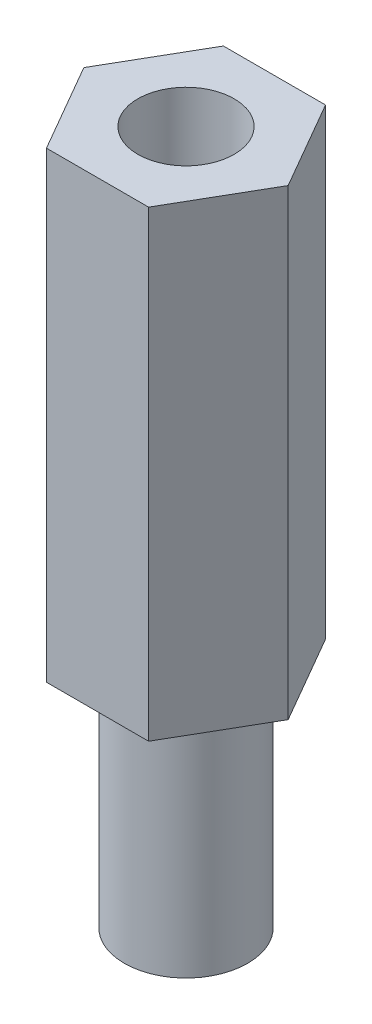
ISO-10303-21;
HEADER;
FILE_DESCRIPTION(('STEP AP214'),'2;1');
FILE_NAME('part.step','',(''),(''),'','','');
FILE_SCHEMA(('AUTOMOTIVE_DESIGN { 1 0 10303 214 1 1 1 1 }'));
ENDSEC;
DATA;
#1=APPLICATION_CONTEXT('core data for automotive mechanical design processes');
#2=APPLICATION_PROTOCOL_DEFINITION('international standard','automotive_design',2000,#1);
#3=PRODUCT_CONTEXT('',#1,'mechanical');
#4=PRODUCT('Part','Part','',(#3));
#5=PRODUCT_RELATED_PRODUCT_CATEGORY('part','',(#4));
#6=PRODUCT_DEFINITION_FORMATION('','',#4);
#7=PRODUCT_DEFINITION_CONTEXT('part definition',#1,'design');
#8=PRODUCT_DEFINITION('design','',#6,#7);
#9=PRODUCT_DEFINITION_SHAPE('','',#8);
#10=(LENGTH_UNIT() NAMED_UNIT(*) SI_UNIT(.MILLI.,.METRE.));
#11=(NAMED_UNIT(*) PLANE_ANGLE_UNIT() SI_UNIT($,.RADIAN.));
#12=(NAMED_UNIT(*) SI_UNIT($,.STERADIAN.) SOLID_ANGLE_UNIT());
#13=UNCERTAINTY_MEASURE_WITH_UNIT(LENGTH_MEASURE(1.E-05),#10,'distance_accuracy_value','');
#14=(GEOMETRIC_REPRESENTATION_CONTEXT(3) GLOBAL_UNCERTAINTY_ASSIGNED_CONTEXT((#13)) GLOBAL_UNIT_ASSIGNED_CONTEXT((#10,
#11,#12)) REPRESENTATION_CONTEXT('',''));
#15=CARTESIAN_POINT('',(0.,0.,0.));
#16=DIRECTION('',(0.,0.,1.));
#17=DIRECTION('',(1.,0.,0.));
#18=AXIS2_PLACEMENT_3D('',#15,#16,#17);
#19=CARTESIAN_POINT('',(-1.325,12.,2.29496732002876));
#20=DIRECTION('',(0.,0.,-1.));
#21=DIRECTION('',(-1.,0.,0.));
#22=AXIS2_PLACEMENT_3D('',#19,#20,#21);
#23=PLANE('',#22);
#24=DIRECTION('',(1.,0.,0.));
#25=VECTOR('',#24,1.);
#26=CARTESIAN_POINT('',(-1.325,0.,2.29496732002876));
#27=LINE('',#26,#25);
#28=CARTESIAN_POINT('',(-1.325,0.,2.29496732002876));
#29=VERTEX_POINT('',#28);
#30=CARTESIAN_POINT('',(1.325,0.,2.29496732002876));
#31=VERTEX_POINT('',#30);
#32=EDGE_CURVE('E122',#29,#31,#27,.T.);
#33=ORIENTED_EDGE('',*,*,#32,.T.);
#34=DIRECTION('',(0.,-1.,0.));
#35=VECTOR('',#34,1.);
#36=CARTESIAN_POINT('',(1.325,12.,2.29496732002876));
#37=LINE('',#36,#35);
#38=CARTESIAN_POINT('',(1.325,12.,2.29496732002876));
#39=VERTEX_POINT('',#38);
#40=EDGE_CURVE('E45',#39,#31,#37,.T.);
#41=ORIENTED_EDGE('',*,*,#40,.F.);
#42=DIRECTION('',(1.,0.,0.));
#43=VECTOR('',#42,1.);
#44=CARTESIAN_POINT('',(-1.325,12.,2.29496732002876));
#45=LINE('',#44,#43);
#46=CARTESIAN_POINT('',(-1.325,12.,2.29496732002876));
#47=VERTEX_POINT('',#46);
#48=EDGE_CURVE('E133',#47,#39,#45,.T.);
#49=ORIENTED_EDGE('',*,*,#48,.F.);
#50=DIRECTION('',(0.,-1.,0.));
#51=VECTOR('',#50,1.);
#52=CARTESIAN_POINT('',(-1.325,12.,2.29496732002876));
#53=LINE('',#52,#51);
#54=EDGE_CURVE('E118',#47,#29,#53,.T.);
#55=ORIENTED_EDGE('',*,*,#54,.T.);
#56=EDGE_LOOP('',(#33,#41,#49,#55));
#57=FACE_BOUND('',#56,.T.);
#58=ADVANCED_FACE('F37',(#57),#23,.F.);
#59=CARTESIAN_POINT('',(1.325,12.,2.29496732002876));
#60=DIRECTION('',(-0.866025403784439,0.,-0.5));
#61=DIRECTION('',(-0.5,0.,0.866025403784439));
#62=AXIS2_PLACEMENT_3D('',#59,#60,#61);
#63=PLANE('',#62);
#64=DIRECTION('',(0.5,0.,-0.866025403784439));
#65=VECTOR('',#64,1.);
#66=CARTESIAN_POINT('',(1.325,0.,2.29496732002876));
#67=LINE('',#66,#65);
#68=CARTESIAN_POINT('',(2.65,0.,0.));
#69=VERTEX_POINT('',#68);
#70=EDGE_CURVE('E125',#31,#69,#67,.T.);
#71=ORIENTED_EDGE('',*,*,#70,.T.);
#72=DIRECTION('',(0.,-1.,0.));
#73=VECTOR('',#72,1.);
#74=CARTESIAN_POINT('',(2.65,12.,0.));
#75=LINE('',#74,#73);
#76=CARTESIAN_POINT('',(2.65,12.,0.));
#77=VERTEX_POINT('',#76);
#78=EDGE_CURVE('E137',#77,#69,#75,.T.);
#79=ORIENTED_EDGE('',*,*,#78,.F.);
#80=DIRECTION('',(0.5,0.,-0.866025403784439));
#81=VECTOR('',#80,1.);
#82=CARTESIAN_POINT('',(1.325,12.,2.29496732002876));
#83=LINE('',#82,#81);
#84=EDGE_CURVE('E91',#39,#77,#83,.T.);
#85=ORIENTED_EDGE('',*,*,#84,.F.);
#86=ORIENTED_EDGE('',*,*,#40,.T.);
#87=EDGE_LOOP('',(#71,#79,#85,#86));
#88=FACE_BOUND('',#87,.T.);
#89=ADVANCED_FACE('F140',(#88),#63,.F.);
#90=CARTESIAN_POINT('',(2.65,12.,0.));
#91=DIRECTION('',(-0.866025403784438,0.,0.5));
#92=DIRECTION('',(0.5,0.,0.866025403784439));
#93=AXIS2_PLACEMENT_3D('',#90,#91,#92);
#94=PLANE('',#93);
#95=DIRECTION('',(-0.5,0.,-0.866025403784439));
#96=VECTOR('',#95,1.);
#97=CARTESIAN_POINT('',(2.65,0.,0.));
#98=LINE('',#97,#96);
#99=CARTESIAN_POINT('',(1.325,0.,-2.29496732002876));
#100=VERTEX_POINT('',#99);
#101=EDGE_CURVE('E128',#69,#100,#98,.T.);
#102=ORIENTED_EDGE('',*,*,#101,.T.);
#103=DIRECTION('',(0.,-1.,0.));
#104=VECTOR('',#103,1.);
#105=CARTESIAN_POINT('',(1.325,12.,-2.29496732002876));
#106=LINE('',#105,#104);
#107=CARTESIAN_POINT('',(1.325,12.,-2.29496732002876));
#108=VERTEX_POINT('',#107);
#109=EDGE_CURVE('E113',#108,#100,#106,.T.);
#110=ORIENTED_EDGE('',*,*,#109,.F.);
#111=DIRECTION('',(-0.5,0.,-0.866025403784439));
#112=VECTOR('',#111,1.);
#113=CARTESIAN_POINT('',(2.65,12.,0.));
#114=LINE('',#113,#112);
#115=EDGE_CURVE('E104',#77,#108,#114,.T.);
#116=ORIENTED_EDGE('',*,*,#115,.F.);
#117=ORIENTED_EDGE('',*,*,#78,.T.);
#118=EDGE_LOOP('',(#102,#110,#116,#117));
#119=FACE_BOUND('',#118,.T.);
#120=ADVANCED_FACE('F148',(#119),#94,.F.);
#121=CARTESIAN_POINT('',(1.325,12.,-2.29496732002876));
#122=DIRECTION('',(0.,0.,1.));
#123=DIRECTION('',(1.,0.,0.));
#124=AXIS2_PLACEMENT_3D('',#121,#122,#123);
#125=PLANE('',#124);
#126=DIRECTION('',(-1.,0.,0.));
#127=VECTOR('',#126,1.);
#128=CARTESIAN_POINT('',(1.325,0.,-2.29496732002876));
#129=LINE('',#128,#127);
#130=CARTESIAN_POINT('',(-1.325,0.,-2.29496732002876));
#131=VERTEX_POINT('',#130);
#132=EDGE_CURVE('E112',#100,#131,#129,.T.);
#133=ORIENTED_EDGE('',*,*,#132,.T.);
#134=DIRECTION('',(0.,-1.,0.));
#135=VECTOR('',#134,1.);
#136=CARTESIAN_POINT('',(-1.325,12.,-2.29496732002876));
#137=LINE('',#136,#135);
#138=CARTESIAN_POINT('',(-1.325,12.,-2.29496732002876));
#139=VERTEX_POINT('',#138);
#140=EDGE_CURVE('E109',#139,#131,#137,.T.);
#141=ORIENTED_EDGE('',*,*,#140,.F.);
#142=DIRECTION('',(-1.,0.,0.));
#143=VECTOR('',#142,1.);
#144=CARTESIAN_POINT('',(1.325,12.,-2.29496732002876));
#145=LINE('',#144,#143);
#146=EDGE_CURVE('E98',#108,#139,#145,.T.);
#147=ORIENTED_EDGE('',*,*,#146,.F.);
#148=ORIENTED_EDGE('',*,*,#109,.T.);
#149=EDGE_LOOP('',(#133,#141,#147,#148));
#150=FACE_BOUND('',#149,.T.);
#151=ADVANCED_FACE('F110',(#150),#125,.F.);
#152=CARTESIAN_POINT('',(-1.325,12.,-2.29496732002876));
#153=DIRECTION('',(0.866025403784439,0.,0.5));
#154=DIRECTION('',(0.5,0.,-0.866025403784439));
#155=AXIS2_PLACEMENT_3D('',#152,#153,#154);
#156=PLANE('',#155);
#157=DIRECTION('',(-0.5,0.,0.866025403784439));
#158=VECTOR('',#157,1.);
#159=CARTESIAN_POINT('',(-1.325,0.,-2.29496732002876));
#160=LINE('',#159,#158);
#161=CARTESIAN_POINT('',(-2.65,0.,0.));
#162=VERTEX_POINT('',#161);
#163=EDGE_CURVE('E76',#131,#162,#160,.T.);
#164=ORIENTED_EDGE('',*,*,#163,.T.);
#165=DIRECTION('',(0.,-1.,0.));
#166=VECTOR('',#165,1.);
#167=CARTESIAN_POINT('',(-2.65,12.,0.));
#168=LINE('',#167,#166);
#169=CARTESIAN_POINT('',(-2.65,12.,0.));
#170=VERTEX_POINT('',#169);
#171=EDGE_CURVE('E114',#170,#162,#168,.T.);
#172=ORIENTED_EDGE('',*,*,#171,.F.);
#173=DIRECTION('',(-0.5,0.,0.866025403784439));
#174=VECTOR('',#173,1.);
#175=CARTESIAN_POINT('',(-1.325,12.,-2.29496732002876));
#176=LINE('',#175,#174);
#177=EDGE_CURVE('E102',#139,#170,#176,.T.);
#178=ORIENTED_EDGE('',*,*,#177,.F.);
#179=ORIENTED_EDGE('',*,*,#140,.T.);
#180=EDGE_LOOP('',(#164,#172,#178,#179));
#181=FACE_BOUND('',#180,.T.);
#182=ADVANCED_FACE('F116',(#181),#156,.F.);
#183=CARTESIAN_POINT('',(-2.65,12.,0.));
#184=DIRECTION('',(0.866025403784438,0.,-0.5));
#185=DIRECTION('',(-0.5,0.,-0.866025403784439));
#186=AXIS2_PLACEMENT_3D('',#183,#184,#185);
#187=PLANE('',#186);
#188=DIRECTION('',(0.5,0.,0.866025403784439));
#189=VECTOR('',#188,1.);
#190=CARTESIAN_POINT('',(-2.65,0.,0.));
#191=LINE('',#190,#189);
#192=EDGE_CURVE('E82',#162,#29,#191,.T.);
#193=ORIENTED_EDGE('',*,*,#192,.T.);
#194=ORIENTED_EDGE('',*,*,#54,.F.);
#195=DIRECTION('',(0.5,0.,0.866025403784439));
#196=VECTOR('',#195,1.);
#197=CARTESIAN_POINT('',(-2.65,12.,0.));
#198=LINE('',#197,#196);
#199=EDGE_CURVE('E53',#170,#47,#198,.T.);
#200=ORIENTED_EDGE('',*,*,#199,.F.);
#201=ORIENTED_EDGE('',*,*,#171,.T.);
#202=EDGE_LOOP('',(#193,#194,#200,#201));
#203=FACE_BOUND('',#202,.T.);
#204=ADVANCED_FACE('F171',(#203),#187,.F.);
#205=CARTESIAN_POINT('',(0.,12.,0.));
#206=DIRECTION('',(0.,1.,0.));
#207=DIRECTION('',(0.,0.,1.));
#208=AXIS2_PLACEMENT_3D('',#205,#206,#207);
#209=PLANE('',#208);
#210=CARTESIAN_POINT('',(0.,12.,0.));
#211=DIRECTION('',(0.,1.,0.));
#212=DIRECTION('',(0.,0.,1.));
#213=AXIS2_PLACEMENT_3D('',#210,#211,#212);
#214=CIRCLE('',#213,1.25);
#215=CARTESIAN_POINT('',(0.,12.,1.25));
#216=VERTEX_POINT('',#215);
#217=EDGE_CURVE('E155',#216,#216,#214,.T.);
#218=ORIENTED_EDGE('',*,*,#217,.F.);
#219=EDGE_LOOP('',(#218));
#220=FACE_BOUND('',#219,.T.);
#221=ORIENTED_EDGE('',*,*,#48,.T.);
#222=ORIENTED_EDGE('',*,*,#84,.T.);
#223=ORIENTED_EDGE('',*,*,#115,.T.);
#224=ORIENTED_EDGE('',*,*,#146,.T.);
#225=ORIENTED_EDGE('',*,*,#177,.T.);
#226=ORIENTED_EDGE('',*,*,#199,.T.);
#227=EDGE_LOOP('',(#221,#222,#223,#224,#225,#226));
#228=FACE_BOUND('',#227,.T.);
#229=ADVANCED_FACE('F100',(#220,#228),#209,.T.);
#230=CARTESIAN_POINT('',(0.,0.,0.));
#231=DIRECTION('',(0.,1.,0.));
#232=DIRECTION('',(0.,0.,1.));
#233=AXIS2_PLACEMENT_3D('',#230,#231,#232);
#234=PLANE('',#233);
#235=CARTESIAN_POINT('',(0.,0.,0.));
#236=DIRECTION('',(0.,1.,0.));
#237=DIRECTION('',(0.,0.,1.));
#238=AXIS2_PLACEMENT_3D('',#235,#236,#237);
#239=CIRCLE('',#238,1.6);
#240=CARTESIAN_POINT('',(0.,0.,1.6));
#241=VERTEX_POINT('',#240);
#242=EDGE_CURVE('E11',#241,#241,#239,.F.);
#243=ORIENTED_EDGE('',*,*,#242,.F.);
#244=EDGE_LOOP('',(#243));
#245=FACE_BOUND('',#244,.T.);
#246=ORIENTED_EDGE('',*,*,#32,.F.);
#247=ORIENTED_EDGE('',*,*,#192,.F.);
#248=ORIENTED_EDGE('',*,*,#163,.F.);
#249=ORIENTED_EDGE('',*,*,#132,.F.);
#250=ORIENTED_EDGE('',*,*,#101,.F.);
#251=ORIENTED_EDGE('',*,*,#70,.F.);
#252=EDGE_LOOP('',(#246,#247,#248,#249,#250,#251));
#253=FACE_BOUND('',#252,.T.);
#254=ADVANCED_FACE('F145',(#245,#253),#234,.F.);
#255=CARTESIAN_POINT('',(0.,-6.,0.));
#256=DIRECTION('',(0.,1.,0.));
#257=DIRECTION('',(0.,0.,1.));
#258=AXIS2_PLACEMENT_3D('',#255,#256,#257);
#259=CYLINDRICAL_SURFACE('',#258,1.6);
#260=CARTESIAN_POINT('',(0.,-6.,0.));
#261=DIRECTION('',(0.,-1.,0.));
#262=DIRECTION('',(0.,0.,-1.));
#263=AXIS2_PLACEMENT_3D('',#260,#261,#262);
#264=CIRCLE('',#263,1.6);
#265=CARTESIAN_POINT('',(0.,-6.,-1.6));
#266=VERTEX_POINT('',#265);
#267=EDGE_CURVE('E126',#266,#266,#264,.T.);
#268=ORIENTED_EDGE('',*,*,#267,.F.);
#269=EDGE_LOOP('',(#268));
#270=FACE_BOUND('',#269,.T.);
#271=ORIENTED_EDGE('',*,*,#242,.T.);
#272=EDGE_LOOP('',(#271));
#273=FACE_BOUND('',#272,.T.);
#274=ADVANCED_FACE('F177',(#270,#273),#259,.T.);
#275=CARTESIAN_POINT('',(0.,-6.,0.));
#276=DIRECTION('',(0.,-1.,0.));
#277=DIRECTION('',(0.,0.,-1.));
#278=AXIS2_PLACEMENT_3D('',#275,#276,#277);
#279=PLANE('',#278);
#280=ORIENTED_EDGE('',*,*,#267,.T.);
#281=EDGE_LOOP('',(#280));
#282=FACE_BOUND('',#281,.T.);
#283=ADVANCED_FACE('F166',(#282),#279,.T.);
#284=CARTESIAN_POINT('',(0.,7.,0.));
#285=DIRECTION('',(0.,1.,0.));
#286=DIRECTION('',(0.,0.,1.));
#287=AXIS2_PLACEMENT_3D('',#284,#285,#286);
#288=CYLINDRICAL_SURFACE('',#287,1.25);
#289=CARTESIAN_POINT('',(0.,7.,0.));
#290=DIRECTION('',(0.,1.,0.));
#291=DIRECTION('',(0.,0.,1.));
#292=AXIS2_PLACEMENT_3D('',#289,#290,#291);
#293=CIRCLE('',#292,1.25);
#294=CARTESIAN_POINT('',(0.,7.,1.25));
#295=VERTEX_POINT('',#294);
#296=EDGE_CURVE('E154',#295,#295,#293,.T.);
#297=ORIENTED_EDGE('',*,*,#296,.F.);
#298=EDGE_LOOP('',(#297));
#299=FACE_BOUND('',#298,.T.);
#300=ORIENTED_EDGE('',*,*,#217,.T.);
#301=EDGE_LOOP('',(#300));
#302=FACE_BOUND('',#301,.T.);
#303=ADVANCED_FACE('F163',(#299,#302),#288,.F.);
#304=CARTESIAN_POINT('',(0.,7.,0.));
#305=DIRECTION('',(0.,1.,0.));
#306=DIRECTION('',(0.,0.,1.));
#307=AXIS2_PLACEMENT_3D('',#304,#305,#306);
#308=PLANE('',#307);
#309=ORIENTED_EDGE('',*,*,#296,.T.);
#310=EDGE_LOOP('',(#309));
#311=FACE_BOUND('',#310,.T.);
#312=ADVANCED_FACE('F161',(#311),#308,.T.);
#313=CLOSED_SHELL('',(#58,#89,#120,#151,#182,#204,#229,#254,#274,#283,#303,#312));
#314=MANIFOLD_SOLID_BREP('B2',#313);
#315=ADVANCED_BREP_SHAPE_REPRESENTATION('',(#18,#314),#14);
#316=SHAPE_DEFINITION_REPRESENTATION(#9,#315);
ENDSEC;
END-ISO-10303-21;
